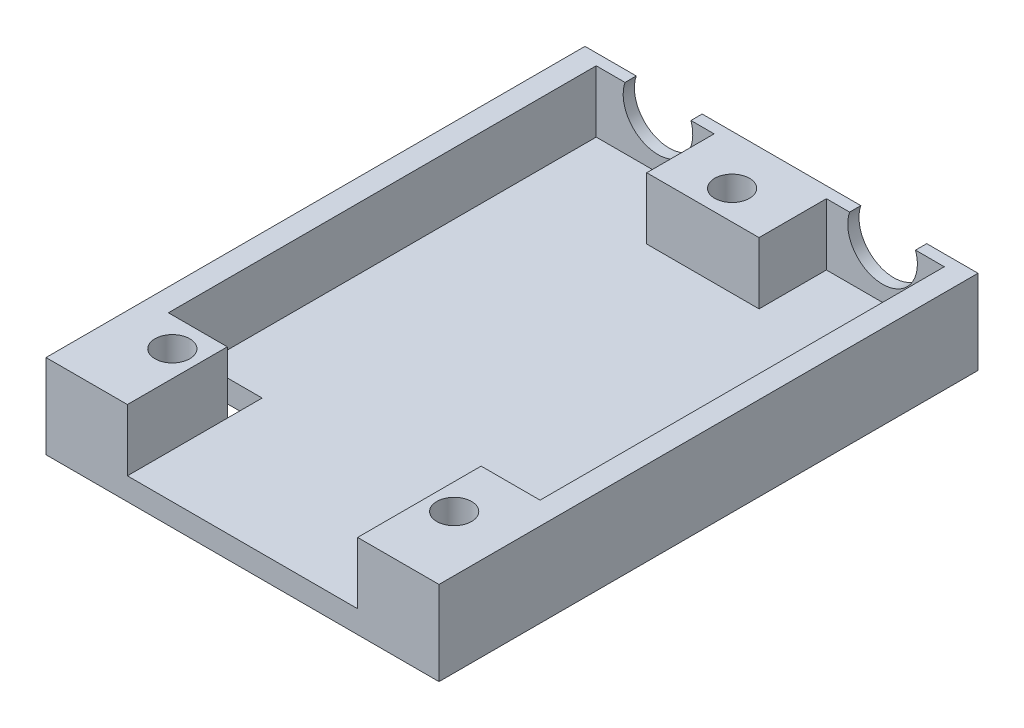
ISO-10303-21;
HEADER;
FILE_DESCRIPTION(('STEP AP214'),'2;1');
FILE_NAME('part.step','',(''),(''),'','','');
FILE_SCHEMA(('AUTOMOTIVE_DESIGN { 1 0 10303 214 1 1 1 1 }'));
ENDSEC;
DATA;
#1=APPLICATION_CONTEXT('core data for automotive mechanical design processes');
#2=APPLICATION_PROTOCOL_DEFINITION('international standard','automotive_design',2000,#1);
#3=PRODUCT_CONTEXT('',#1,'mechanical');
#4=PRODUCT('Part','Part','',(#3));
#5=PRODUCT_RELATED_PRODUCT_CATEGORY('part','',(#4));
#6=PRODUCT_DEFINITION_FORMATION('','',#4);
#7=PRODUCT_DEFINITION_CONTEXT('part definition',#1,'design');
#8=PRODUCT_DEFINITION('design','',#6,#7);
#9=PRODUCT_DEFINITION_SHAPE('','',#8);
#10=(LENGTH_UNIT() NAMED_UNIT(*) SI_UNIT(.MILLI.,.METRE.));
#11=(NAMED_UNIT(*) PLANE_ANGLE_UNIT() SI_UNIT($,.RADIAN.));
#12=(NAMED_UNIT(*) SI_UNIT($,.STERADIAN.) SOLID_ANGLE_UNIT());
#13=UNCERTAINTY_MEASURE_WITH_UNIT(LENGTH_MEASURE(1.E-05),#10,'distance_accuracy_value','');
#14=(GEOMETRIC_REPRESENTATION_CONTEXT(3) GLOBAL_UNCERTAINTY_ASSIGNED_CONTEXT((#13)) GLOBAL_UNIT_ASSIGNED_CONTEXT((#10,
#11,#12)) REPRESENTATION_CONTEXT('',''));
#15=CARTESIAN_POINT('',(0.,0.,0.));
#16=DIRECTION('',(0.,0.,1.));
#17=DIRECTION('',(1.,0.,0.));
#18=AXIS2_PLACEMENT_3D('',#15,#16,#17);
#19=CARTESIAN_POINT('',(0.,7.5,-23.));
#20=DIRECTION('',(0.,0.,-1.));
#21=DIRECTION('',(-1.,0.,0.));
#22=AXIS2_PLACEMENT_3D('',#19,#20,#21);
#23=PLANE('',#22);
#24=CARTESIAN_POINT('',(-10.,6.5,-23.));
#25=DIRECTION('',(0.,0.,-1.));
#26=DIRECTION('',(-1.,0.,0.));
#27=AXIS2_PLACEMENT_3D('',#24,#25,#26);
#28=CIRCLE('',#27,3.1);
#29=CARTESIAN_POINT('',(-12.9342801502242,7.5,-23.));
#30=VERTEX_POINT('',#29);
#31=CARTESIAN_POINT('',(-7.06571984977576,7.5,-23.));
#32=VERTEX_POINT('',#31);
#33=EDGE_CURVE('E303',#30,#32,#28,.F.);
#34=ORIENTED_EDGE('',*,*,#33,.F.);
#35=DIRECTION('',(1.,0.,0.));
#36=VECTOR('',#35,1.);
#37=CARTESIAN_POINT('',(0.,7.5,-23.));
#38=LINE('',#37,#36);
#39=CARTESIAN_POINT('',(-15.5,7.5,-23.));
#40=VERTEX_POINT('',#39);
#41=EDGE_CURVE('E494',#40,#30,#38,.T.);
#42=ORIENTED_EDGE('',*,*,#41,.F.);
#43=DIRECTION('',(0.,-1.,0.));
#44=VECTOR('',#43,1.);
#45=CARTESIAN_POINT('',(-15.5,7.5,-23.));
#46=LINE('',#45,#44);
#47=CARTESIAN_POINT('',(-15.5,2.,-23.));
#48=VERTEX_POINT('',#47);
#49=EDGE_CURVE('E249',#40,#48,#46,.T.);
#50=ORIENTED_EDGE('',*,*,#49,.T.);
#51=DIRECTION('',(1.,0.,0.));
#52=VECTOR('',#51,1.);
#53=CARTESIAN_POINT('',(0.,2.,-23.));
#54=LINE('',#53,#52);
#55=CARTESIAN_POINT('',(-4.99999999999998,2.,-23.));
#56=VERTEX_POINT('',#55);
#57=EDGE_CURVE('E502',#48,#56,#54,.T.);
#58=ORIENTED_EDGE('',*,*,#57,.T.);
#59=DIRECTION('',(0.,-1.,0.));
#60=VECTOR('',#59,1.);
#61=CARTESIAN_POINT('',(-4.99999999999998,7.5,-23.));
#62=LINE('',#61,#60);
#63=CARTESIAN_POINT('',(-4.99999999999998,7.5,-23.));
#64=VERTEX_POINT('',#63);
#65=EDGE_CURVE('E452',#64,#56,#62,.T.);
#66=ORIENTED_EDGE('',*,*,#65,.F.);
#67=EDGE_CURVE('E497',#32,#64,#38,.T.);
#68=ORIENTED_EDGE('',*,*,#67,.F.);
#69=EDGE_LOOP('',(#34,#42,#50,#58,#66,#68));
#70=FACE_BOUND('',#69,.T.);
#71=ADVANCED_FACE('F41',(#70),#23,.F.);
#72=CARTESIAN_POINT('',(10.,6.5,-23.));
#73=DIRECTION('',(0.,0.,-1.));
#74=DIRECTION('',(-1.,0.,0.));
#75=AXIS2_PLACEMENT_3D('',#72,#73,#74);
#76=CIRCLE('',#75,3.1);
#77=CARTESIAN_POINT('',(7.06571984977576,7.5,-23.));
#78=VERTEX_POINT('',#77);
#79=CARTESIAN_POINT('',(12.9342801502242,7.5,-23.));
#80=VERTEX_POINT('',#79);
#81=EDGE_CURVE('E308',#78,#80,#76,.F.);
#82=ORIENTED_EDGE('',*,*,#81,.F.);
#83=CARTESIAN_POINT('',(5.00000000000002,7.5,-23.));
#84=VERTEX_POINT('',#83);
#85=EDGE_CURVE('E498',#84,#78,#38,.T.);
#86=ORIENTED_EDGE('',*,*,#85,.F.);
#87=DIRECTION('',(0.,-1.,0.));
#88=VECTOR('',#87,1.);
#89=CARTESIAN_POINT('',(5.00000000000002,7.5,-23.));
#90=LINE('',#89,#88);
#91=CARTESIAN_POINT('',(5.00000000000002,2.,-23.));
#92=VERTEX_POINT('',#91);
#93=EDGE_CURVE('E464',#84,#92,#90,.T.);
#94=ORIENTED_EDGE('',*,*,#93,.T.);
#95=CARTESIAN_POINT('',(15.5,2.,-23.));
#96=VERTEX_POINT('',#95);
#97=EDGE_CURVE('E474',#92,#96,#54,.T.);
#98=ORIENTED_EDGE('',*,*,#97,.T.);
#99=DIRECTION('',(0.,-1.,0.));
#100=VECTOR('',#99,1.);
#101=CARTESIAN_POINT('',(15.5,7.5,-23.));
#102=LINE('',#101,#100);
#103=CARTESIAN_POINT('',(15.5,7.5,-23.));
#104=VERTEX_POINT('',#103);
#105=EDGE_CURVE('E516',#104,#96,#102,.T.);
#106=ORIENTED_EDGE('',*,*,#105,.F.);
#107=EDGE_CURVE('E493',#80,#104,#38,.T.);
#108=ORIENTED_EDGE('',*,*,#107,.F.);
#109=EDGE_LOOP('',(#82,#86,#94,#98,#106,#108));
#110=FACE_BOUND('',#109,.T.);
#111=ADVANCED_FACE('F597',(#110),#23,.F.);
#112=CARTESIAN_POINT('',(-17.5,2.,-24.));
#113=DIRECTION('',(0.,0.,1.));
#114=DIRECTION('',(1.,0.,0.));
#115=AXIS2_PLACEMENT_3D('',#112,#113,#114);
#116=PLANE('',#115);
#117=CARTESIAN_POINT('',(10.,6.5,-24.));
#118=DIRECTION('',(0.,0.,-1.));
#119=DIRECTION('',(-1.,0.,0.));
#120=AXIS2_PLACEMENT_3D('',#117,#118,#119);
#121=CIRCLE('',#120,3.1);
#122=CARTESIAN_POINT('',(7.06571984977576,7.5,-24.));
#123=VERTEX_POINT('',#122);
#124=CARTESIAN_POINT('',(12.9342801502242,7.5,-24.));
#125=VERTEX_POINT('',#124);
#126=EDGE_CURVE('E299',#123,#125,#121,.F.);
#127=ORIENTED_EDGE('',*,*,#126,.T.);
#128=DIRECTION('',(-1.,0.,0.));
#129=VECTOR('',#128,1.);
#130=CARTESIAN_POINT('',(0.,7.5,-24.));
#131=LINE('',#130,#129);
#132=CARTESIAN_POINT('',(17.5,7.5,-24.));
#133=VERTEX_POINT('',#132);
#134=EDGE_CURVE('E475',#133,#125,#131,.T.);
#135=ORIENTED_EDGE('',*,*,#134,.F.);
#136=DIRECTION('',(0.,-1.,0.));
#137=VECTOR('',#136,1.);
#138=CARTESIAN_POINT('',(17.5,2.,-24.));
#139=LINE('',#138,#137);
#140=CARTESIAN_POINT('',(17.5,0.,-24.));
#141=VERTEX_POINT('',#140);
#142=EDGE_CURVE('E537',#133,#141,#139,.T.);
#143=ORIENTED_EDGE('',*,*,#142,.T.);
#144=DIRECTION('',(-1.,0.,0.));
#145=VECTOR('',#144,1.);
#146=CARTESIAN_POINT('',(-17.5,0.,-24.));
#147=LINE('',#146,#145);
#148=CARTESIAN_POINT('',(-17.5,0.,-24.));
#149=VERTEX_POINT('',#148);
#150=EDGE_CURVE('E530',#141,#149,#147,.T.);
#151=ORIENTED_EDGE('',*,*,#150,.T.);
#152=DIRECTION('',(0.,-1.,0.));
#153=VECTOR('',#152,1.);
#154=CARTESIAN_POINT('',(-17.5,2.,-24.));
#155=LINE('',#154,#153);
#156=CARTESIAN_POINT('',(-17.5,7.5,-24.));
#157=VERTEX_POINT('',#156);
#158=EDGE_CURVE('E533',#157,#149,#155,.T.);
#159=ORIENTED_EDGE('',*,*,#158,.F.);
#160=CARTESIAN_POINT('',(-12.9342801502242,7.5,-24.));
#161=VERTEX_POINT('',#160);
#162=EDGE_CURVE('E481',#161,#157,#131,.T.);
#163=ORIENTED_EDGE('',*,*,#162,.F.);
#164=CARTESIAN_POINT('',(-10.,6.5,-24.));
#165=DIRECTION('',(0.,0.,-1.));
#166=DIRECTION('',(-1.,0.,0.));
#167=AXIS2_PLACEMENT_3D('',#164,#165,#166);
#168=CIRCLE('',#167,3.1);
#169=CARTESIAN_POINT('',(-7.06571984977576,7.5,-24.));
#170=VERTEX_POINT('',#169);
#171=EDGE_CURVE('E65',#161,#170,#168,.F.);
#172=ORIENTED_EDGE('',*,*,#171,.T.);
#173=EDGE_CURVE('E480',#123,#170,#131,.T.);
#174=ORIENTED_EDGE('',*,*,#173,.F.);
#175=EDGE_LOOP('',(#127,#135,#143,#151,#159,#163,#172,#174));
#176=FACE_BOUND('',#175,.T.);
#177=ADVANCED_FACE('F566',(#176),#116,.F.);
#178=CARTESIAN_POINT('',(0.,7.5,0.));
#179=DIRECTION('',(0.,1.,0.));
#180=DIRECTION('',(0.,0.,1.));
#181=AXIS2_PLACEMENT_3D('',#178,#179,#180);
#182=PLANE('',#181);
#183=CARTESIAN_POINT('',(12.55,7.5,17.7));
#184=DIRECTION('',(0.,1.,0.));
#185=DIRECTION('',(0.,0.,1.));
#186=AXIS2_PLACEMENT_3D('',#183,#184,#185);
#187=CIRCLE('',#186,1.55);
#188=CARTESIAN_POINT('',(12.55,7.5,19.25));
#189=VERTEX_POINT('',#188);
#190=EDGE_CURVE('E947',#189,#189,#187,.T.);
#191=ORIENTED_EDGE('',*,*,#190,.F.);
#192=EDGE_LOOP('',(#191));
#193=FACE_BOUND('',#192,.T.);
#194=ORIENTED_EDGE('',*,*,#134,.T.);
#195=DIRECTION('',(0.,0.,-1.));
#196=VECTOR('',#195,1.);
#197=CARTESIAN_POINT('',(12.9342801502242,7.5,-22.));
#198=LINE('',#197,#196);
#199=EDGE_CURVE('E11',#125,#80,#198,.F.);
#200=ORIENTED_EDGE('',*,*,#199,.T.);
#201=ORIENTED_EDGE('',*,*,#107,.T.);
#202=DIRECTION('',(0.,0.,1.));
#203=VECTOR('',#202,1.);
#204=CARTESIAN_POINT('',(15.5,7.5,0.));
#205=LINE('',#204,#203);
#206=CARTESIAN_POINT('',(15.5,7.5,13.));
#207=VERTEX_POINT('',#206);
#208=EDGE_CURVE('E255',#104,#207,#205,.T.);
#209=ORIENTED_EDGE('',*,*,#208,.T.);
#210=DIRECTION('',(-1.,0.,0.));
#211=VECTOR('',#210,1.);
#212=CARTESIAN_POINT('',(15.5,7.5,13.));
#213=LINE('',#212,#211);
#214=CARTESIAN_POINT('',(10.25,7.5,13.));
#215=VERTEX_POINT('',#214);
#216=EDGE_CURVE('E414',#207,#215,#213,.T.);
#217=ORIENTED_EDGE('',*,*,#216,.T.);
#218=DIRECTION('',(0.,0.,1.));
#219=VECTOR('',#218,1.);
#220=CARTESIAN_POINT('',(10.25,7.5,21.));
#221=LINE('',#220,#219);
#222=CARTESIAN_POINT('',(10.25,7.5,24.));
#223=VERTEX_POINT('',#222);
#224=EDGE_CURVE('E417',#215,#223,#221,.T.);
#225=ORIENTED_EDGE('',*,*,#224,.T.);
#226=DIRECTION('',(1.,0.,0.));
#227=VECTOR('',#226,1.);
#228=CARTESIAN_POINT('',(0.,7.5,24.));
#229=LINE('',#228,#227);
#230=CARTESIAN_POINT('',(17.5,7.5,24.));
#231=VERTEX_POINT('',#230);
#232=EDGE_CURVE('E485',#223,#231,#229,.T.);
#233=ORIENTED_EDGE('',*,*,#232,.T.);
#234=DIRECTION('',(0.,0.,-1.));
#235=VECTOR('',#234,1.);
#236=CARTESIAN_POINT('',(17.5,7.5,0.));
#237=LINE('',#236,#235);
#238=EDGE_CURVE('E489',#231,#133,#237,.T.);
#239=ORIENTED_EDGE('',*,*,#238,.T.);
#240=EDGE_LOOP('',(#194,#200,#201,#209,#217,#225,#233,#239));
#241=FACE_BOUND('',#240,.T.);
#242=ADVANCED_FACE('F609',(#193,#241),#182,.T.);
#243=CARTESIAN_POINT('',(0.,7.5,-19.6));
#244=DIRECTION('',(0.,1.,0.));
#245=DIRECTION('',(0.,0.,1.));
#246=AXIS2_PLACEMENT_3D('',#243,#244,#245);
#247=CIRCLE('',#246,1.55);
#248=CARTESIAN_POINT('',(0.,7.5,-18.05));
#249=VERTEX_POINT('',#248);
#250=EDGE_CURVE('E960',#249,#249,#247,.T.);
#251=ORIENTED_EDGE('',*,*,#250,.F.);
#252=EDGE_LOOP('',(#251));
#253=FACE_BOUND('',#252,.T.);
#254=ORIENTED_EDGE('',*,*,#85,.T.);
#255=DIRECTION('',(0.,0.,-1.));
#256=VECTOR('',#255,1.);
#257=CARTESIAN_POINT('',(7.06571984977576,7.5,-22.));
#258=LINE('',#257,#256);
#259=EDGE_CURVE('E50',#78,#123,#258,.T.);
#260=ORIENTED_EDGE('',*,*,#259,.T.);
#261=ORIENTED_EDGE('',*,*,#173,.T.);
#262=DIRECTION('',(0.,0.,-1.));
#263=VECTOR('',#262,1.);
#264=CARTESIAN_POINT('',(-7.06571984977576,7.5,-22.));
#265=LINE('',#264,#263);
#266=EDGE_CURVE('E552',#170,#32,#265,.F.);
#267=ORIENTED_EDGE('',*,*,#266,.T.);
#268=ORIENTED_EDGE('',*,*,#67,.T.);
#269=DIRECTION('',(0.,0.,1.));
#270=VECTOR('',#269,1.);
#271=CARTESIAN_POINT('',(-4.99999999999998,7.5,-23.));
#272=LINE('',#271,#270);
#273=CARTESIAN_POINT('',(-4.99999999999998,7.5,-17.));
#274=VERTEX_POINT('',#273);
#275=EDGE_CURVE('E441',#64,#274,#272,.T.);
#276=ORIENTED_EDGE('',*,*,#275,.T.);
#277=DIRECTION('',(1.,0.,0.));
#278=VECTOR('',#277,1.);
#279=CARTESIAN_POINT('',(-4.99999999999998,7.5,-17.));
#280=LINE('',#279,#278);
#281=CARTESIAN_POINT('',(5.00000000000002,7.5,-17.));
#282=VERTEX_POINT('',#281);
#283=EDGE_CURVE('E445',#274,#282,#280,.T.);
#284=ORIENTED_EDGE('',*,*,#283,.T.);
#285=DIRECTION('',(0.,0.,-1.));
#286=VECTOR('',#285,1.);
#287=CARTESIAN_POINT('',(5.00000000000002,7.5,-23.));
#288=LINE('',#287,#286);
#289=EDGE_CURVE('E449',#282,#84,#288,.T.);
#290=ORIENTED_EDGE('',*,*,#289,.T.);
#291=EDGE_LOOP('',(#254,#260,#261,#267,#268,#276,#284,#290));
#292=FACE_BOUND('',#291,.T.);
#293=ADVANCED_FACE('F561',(#253,#292),#182,.T.);
#294=CARTESIAN_POINT('',(-12.55,7.5,17.7));
#295=DIRECTION('',(0.,1.,0.));
#296=DIRECTION('',(0.,0.,1.));
#297=AXIS2_PLACEMENT_3D('',#294,#295,#296);
#298=CIRCLE('',#297,1.55);
#299=CARTESIAN_POINT('',(-12.55,7.5,19.25));
#300=VERTEX_POINT('',#299);
#301=EDGE_CURVE('E274',#300,#300,#298,.T.);
#302=ORIENTED_EDGE('',*,*,#301,.F.);
#303=EDGE_LOOP('',(#302));
#304=FACE_BOUND('',#303,.T.);
#305=DIRECTION('',(1.,0.,0.));
#306=VECTOR('',#305,1.);
#307=CARTESIAN_POINT('',(-15.5,7.5,15.1));
#308=LINE('',#307,#306);
#309=CARTESIAN_POINT('',(-15.5,7.5,15.1));
#310=VERTEX_POINT('',#309);
#311=CARTESIAN_POINT('',(-10.25,7.5,15.1));
#312=VERTEX_POINT('',#311);
#313=EDGE_CURVE('E258',#310,#312,#308,.T.);
#314=ORIENTED_EDGE('',*,*,#313,.F.);
#315=DIRECTION('',(0.,0.,1.));
#316=VECTOR('',#315,1.);
#317=CARTESIAN_POINT('',(-15.5,7.5,0.));
#318=LINE('',#317,#316);
#319=EDGE_CURVE('E242',#40,#310,#318,.T.);
#320=ORIENTED_EDGE('',*,*,#319,.F.);
#321=ORIENTED_EDGE('',*,*,#41,.T.);
#322=DIRECTION('',(0.,0.,-1.));
#323=VECTOR('',#322,1.);
#324=CARTESIAN_POINT('',(-12.9342801502242,7.5,-22.));
#325=LINE('',#324,#323);
#326=EDGE_CURVE('E549',#30,#161,#325,.T.);
#327=ORIENTED_EDGE('',*,*,#326,.T.);
#328=ORIENTED_EDGE('',*,*,#162,.T.);
#329=DIRECTION('',(0.,0.,1.));
#330=VECTOR('',#329,1.);
#331=CARTESIAN_POINT('',(-17.5,7.5,0.));
#332=LINE('',#331,#330);
#333=CARTESIAN_POINT('',(-17.5,7.5,24.));
#334=VERTEX_POINT('',#333);
#335=EDGE_CURVE('E479',#157,#334,#332,.T.);
#336=ORIENTED_EDGE('',*,*,#335,.T.);
#337=CARTESIAN_POINT('',(-10.25,7.5,24.));
#338=VERTEX_POINT('',#337);
#339=EDGE_CURVE('E486',#334,#338,#229,.T.);
#340=ORIENTED_EDGE('',*,*,#339,.T.);
#341=DIRECTION('',(0.,0.,-1.));
#342=VECTOR('',#341,1.);
#343=CARTESIAN_POINT('',(-10.25,7.5,21.));
#344=LINE('',#343,#342);
#345=EDGE_CURVE('E268',#338,#312,#344,.T.);
#346=ORIENTED_EDGE('',*,*,#345,.T.);
#347=EDGE_LOOP('',(#314,#320,#321,#327,#328,#336,#340,#346));
#348=FACE_BOUND('',#347,.T.);
#349=ADVANCED_FACE('F266',(#304,#348),#182,.T.);
#350=CARTESIAN_POINT('',(0.,0.,0.));
#351=DIRECTION('',(0.,1.,0.));
#352=DIRECTION('',(0.,0.,1.));
#353=AXIS2_PLACEMENT_3D('',#350,#351,#352);
#354=PLANE('',#353);
#355=DIRECTION('',(1.,0.,0.));
#356=VECTOR('',#355,1.);
#357=CARTESIAN_POINT('',(-15.5,0.,12.));
#358=LINE('',#357,#356);
#359=CARTESIAN_POINT('',(-15.5,0.,12.));
#360=VERTEX_POINT('',#359);
#361=CARTESIAN_POINT('',(-10.25,0.,12.));
#362=VERTEX_POINT('',#361);
#363=EDGE_CURVE('E589',#360,#362,#358,.T.);
#364=ORIENTED_EDGE('',*,*,#363,.F.);
#365=DIRECTION('',(0.,0.,-1.));
#366=VECTOR('',#365,1.);
#367=CARTESIAN_POINT('',(-15.5,0.,12.));
#368=LINE('',#367,#366);
#369=CARTESIAN_POINT('',(-15.5,0.,15.1));
#370=VERTEX_POINT('',#369);
#371=EDGE_CURVE('E278',#370,#360,#368,.T.);
#372=ORIENTED_EDGE('',*,*,#371,.F.);
#373=DIRECTION('',(-1.,0.,0.));
#374=VECTOR('',#373,1.);
#375=CARTESIAN_POINT('',(-15.5,0.,15.1));
#376=LINE('',#375,#374);
#377=CARTESIAN_POINT('',(-10.25,0.,15.1));
#378=VERTEX_POINT('',#377);
#379=EDGE_CURVE('E261',#378,#370,#376,.T.);
#380=ORIENTED_EDGE('',*,*,#379,.F.);
#381=DIRECTION('',(0.,0.,1.));
#382=VECTOR('',#381,1.);
#383=CARTESIAN_POINT('',(-10.25,0.,12.));
#384=LINE('',#383,#382);
#385=EDGE_CURVE('E284',#362,#378,#384,.T.);
#386=ORIENTED_EDGE('',*,*,#385,.F.);
#387=EDGE_LOOP('',(#364,#372,#380,#386));
#388=FACE_BOUND('',#387,.T.);
#389=DIRECTION('',(0.,0.,-1.));
#390=VECTOR('',#389,1.);
#391=CARTESIAN_POINT('',(-2.44999999999999,0.,8.5));
#392=LINE('',#391,#390);
#393=CARTESIAN_POINT('',(-2.44999999999999,0.,8.5));
#394=VERTEX_POINT('',#393);
#395=CARTESIAN_POINT('',(-2.44999999999999,0.,3.6));
#396=VERTEX_POINT('',#395);
#397=EDGE_CURVE('E356',#394,#396,#392,.T.);
#398=ORIENTED_EDGE('',*,*,#397,.F.);
#399=DIRECTION('',(-1.,0.,0.));
#400=VECTOR('',#399,1.);
#401=CARTESIAN_POINT('',(-2.44999999999999,0.,8.5));
#402=LINE('',#401,#400);
#403=CARTESIAN_POINT('',(2.45000000000001,0.,8.5));
#404=VERTEX_POINT('',#403);
#405=EDGE_CURVE('E362',#404,#394,#402,.T.);
#406=ORIENTED_EDGE('',*,*,#405,.F.);
#407=DIRECTION('',(0.,0.,1.));
#408=VECTOR('',#407,1.);
#409=CARTESIAN_POINT('',(2.45000000000001,0.,8.5));
#410=LINE('',#409,#408);
#411=CARTESIAN_POINT('',(2.45000000000001,0.,3.6));
#412=VERTEX_POINT('',#411);
#413=EDGE_CURVE('E379',#412,#404,#410,.T.);
#414=ORIENTED_EDGE('',*,*,#413,.F.);
#415=DIRECTION('',(1.,0.,0.));
#416=VECTOR('',#415,1.);
#417=CARTESIAN_POINT('',(-2.44999999999999,0.,3.6));
#418=LINE('',#417,#416);
#419=EDGE_CURVE('E375',#396,#412,#418,.T.);
#420=ORIENTED_EDGE('',*,*,#419,.F.);
#421=EDGE_LOOP('',(#398,#406,#414,#420));
#422=FACE_BOUND('',#421,.T.);
#423=DIRECTION('',(0.,0.,1.));
#424=VECTOR('',#423,1.);
#425=CARTESIAN_POINT('',(-17.5,0.,-24.));
#426=LINE('',#425,#424);
#427=CARTESIAN_POINT('',(-17.5,0.,24.));
#428=VERTEX_POINT('',#427);
#429=EDGE_CURVE('E520',#149,#428,#426,.T.);
#430=ORIENTED_EDGE('',*,*,#429,.F.);
#431=ORIENTED_EDGE('',*,*,#150,.F.);
#432=DIRECTION('',(0.,0.,-1.));
#433=VECTOR('',#432,1.);
#434=CARTESIAN_POINT('',(17.5,0.,-24.));
#435=LINE('',#434,#433);
#436=CARTESIAN_POINT('',(17.5,0.,24.));
#437=VERTEX_POINT('',#436);
#438=EDGE_CURVE('E527',#437,#141,#435,.T.);
#439=ORIENTED_EDGE('',*,*,#438,.F.);
#440=DIRECTION('',(1.,0.,0.));
#441=VECTOR('',#440,1.);
#442=CARTESIAN_POINT('',(-17.5,0.,24.));
#443=LINE('',#442,#441);
#444=EDGE_CURVE('E524',#428,#437,#443,.T.);
#445=ORIENTED_EDGE('',*,*,#444,.F.);
#446=EDGE_LOOP('',(#430,#431,#439,#445));
#447=FACE_BOUND('',#446,.T.);
#448=DIRECTION('',(0.,0.,-1.));
#449=VECTOR('',#448,1.);
#450=CARTESIAN_POINT('',(-2.44999999999999,0.,-3.6));
#451=LINE('',#450,#449);
#452=CARTESIAN_POINT('',(-2.44999999999999,0.,-3.6));
#453=VERTEX_POINT('',#452);
#454=CARTESIAN_POINT('',(-2.44999999999999,0.,-8.5));
#455=VERTEX_POINT('',#454);
#456=EDGE_CURVE('E311',#453,#455,#451,.T.);
#457=ORIENTED_EDGE('',*,*,#456,.F.);
#458=DIRECTION('',(-1.,0.,0.));
#459=VECTOR('',#458,1.);
#460=CARTESIAN_POINT('',(-2.44999999999999,0.,-3.6));
#461=LINE('',#460,#459);
#462=CARTESIAN_POINT('',(2.45000000000001,0.,-3.6));
#463=VERTEX_POINT('',#462);
#464=EDGE_CURVE('E317',#463,#453,#461,.T.);
#465=ORIENTED_EDGE('',*,*,#464,.F.);
#466=DIRECTION('',(0.,0.,1.));
#467=VECTOR('',#466,1.);
#468=CARTESIAN_POINT('',(2.45000000000001,0.,-3.6));
#469=LINE('',#468,#467);
#470=CARTESIAN_POINT('',(2.45000000000001,0.,-8.5));
#471=VERTEX_POINT('',#470);
#472=EDGE_CURVE('E334',#471,#463,#469,.T.);
#473=ORIENTED_EDGE('',*,*,#472,.F.);
#474=DIRECTION('',(1.,0.,0.));
#475=VECTOR('',#474,1.);
#476=CARTESIAN_POINT('',(-2.44999999999999,0.,-8.5));
#477=LINE('',#476,#475);
#478=EDGE_CURVE('E330',#455,#471,#477,.T.);
#479=ORIENTED_EDGE('',*,*,#478,.F.);
#480=EDGE_LOOP('',(#457,#465,#473,#479));
#481=FACE_BOUND('',#480,.T.);
#482=ADVANCED_FACE('F622',(#388,#422,#447,#481),#354,.F.);
#483=CARTESIAN_POINT('',(0.,2.,0.));
#484=DIRECTION('',(0.,1.,0.));
#485=DIRECTION('',(0.,0.,1.));
#486=AXIS2_PLACEMENT_3D('',#483,#484,#485);
#487=PLANE('',#486);
#488=DIRECTION('',(-1.,0.,0.));
#489=VECTOR('',#488,1.);
#490=CARTESIAN_POINT('',(0.,2.,12.));
#491=LINE('',#490,#489);
#492=CARTESIAN_POINT('',(-10.25,2.,12.));
#493=VERTEX_POINT('',#492);
#494=CARTESIAN_POINT('',(-15.5,2.,12.));
#495=VERTEX_POINT('',#494);
#496=EDGE_CURVE('E296',#493,#495,#491,.T.);
#497=ORIENTED_EDGE('',*,*,#496,.F.);
#498=DIRECTION('',(0.,0.,-1.));
#499=VECTOR('',#498,1.);
#500=CARTESIAN_POINT('',(-10.25,2.,0.));
#501=LINE('',#500,#499);
#502=CARTESIAN_POINT('',(-10.25,2.,15.1));
#503=VERTEX_POINT('',#502);
#504=EDGE_CURVE('E293',#503,#493,#501,.T.);
#505=ORIENTED_EDGE('',*,*,#504,.F.);
#506=DIRECTION('',(0.,0.,-1.));
#507=VECTOR('',#506,1.);
#508=CARTESIAN_POINT('',(-10.25,2.,21.));
#509=LINE('',#508,#507);
#510=CARTESIAN_POINT('',(-10.25,2.,24.));
#511=VERTEX_POINT('',#510);
#512=EDGE_CURVE('E434',#511,#503,#509,.T.);
#513=ORIENTED_EDGE('',*,*,#512,.F.);
#514=DIRECTION('',(1.,0.,0.));
#515=VECTOR('',#514,1.);
#516=CARTESIAN_POINT('',(-10.25,2.,24.));
#517=LINE('',#516,#515);
#518=CARTESIAN_POINT('',(10.25,2.,24.));
#519=VERTEX_POINT('',#518);
#520=EDGE_CURVE('E407',#511,#519,#517,.T.);
#521=ORIENTED_EDGE('',*,*,#520,.T.);
#522=DIRECTION('',(0.,0.,1.));
#523=VECTOR('',#522,1.);
#524=CARTESIAN_POINT('',(10.25,2.,21.));
#525=LINE('',#524,#523);
#526=CARTESIAN_POINT('',(10.25,2.,13.));
#527=VERTEX_POINT('',#526);
#528=EDGE_CURVE('E418',#527,#519,#525,.T.);
#529=ORIENTED_EDGE('',*,*,#528,.F.);
#530=DIRECTION('',(-1.,0.,0.));
#531=VECTOR('',#530,1.);
#532=CARTESIAN_POINT('',(15.5,2.,13.));
#533=LINE('',#532,#531);
#534=CARTESIAN_POINT('',(15.5,2.,13.));
#535=VERTEX_POINT('',#534);
#536=EDGE_CURVE('E406',#535,#527,#533,.T.);
#537=ORIENTED_EDGE('',*,*,#536,.F.);
#538=DIRECTION('',(0.,0.,1.));
#539=VECTOR('',#538,1.);
#540=CARTESIAN_POINT('',(15.5,2.,0.));
#541=LINE('',#540,#539);
#542=EDGE_CURVE('E506',#96,#535,#541,.T.);
#543=ORIENTED_EDGE('',*,*,#542,.F.);
#544=ORIENTED_EDGE('',*,*,#97,.F.);
#545=DIRECTION('',(0.,0.,-1.));
#546=VECTOR('',#545,1.);
#547=CARTESIAN_POINT('',(5.00000000000002,2.,-23.));
#548=LINE('',#547,#546);
#549=CARTESIAN_POINT('',(5.00000000000002,2.,-17.));
#550=VERTEX_POINT('',#549);
#551=EDGE_CURVE('E446',#550,#92,#548,.T.);
#552=ORIENTED_EDGE('',*,*,#551,.F.);
#553=DIRECTION('',(1.,0.,0.));
#554=VECTOR('',#553,1.);
#555=CARTESIAN_POINT('',(-4.99999999999998,2.,-17.));
#556=LINE('',#555,#554);
#557=CARTESIAN_POINT('',(-4.99999999999998,2.,-17.));
#558=VERTEX_POINT('',#557);
#559=EDGE_CURVE('E456',#558,#550,#556,.T.);
#560=ORIENTED_EDGE('',*,*,#559,.F.);
#561=DIRECTION('',(0.,0.,1.));
#562=VECTOR('',#561,1.);
#563=CARTESIAN_POINT('',(-4.99999999999998,2.,-23.));
#564=LINE('',#563,#562);
#565=EDGE_CURVE('E437',#56,#558,#564,.T.);
#566=ORIENTED_EDGE('',*,*,#565,.F.);
#567=ORIENTED_EDGE('',*,*,#57,.F.);
#568=DIRECTION('',(0.,0.,1.));
#569=VECTOR('',#568,1.);
#570=CARTESIAN_POINT('',(-15.5,2.,0.));
#571=LINE('',#570,#569);
#572=EDGE_CURVE('E510',#48,#495,#571,.T.);
#573=ORIENTED_EDGE('',*,*,#572,.T.);
#574=EDGE_LOOP('',(#497,#505,#513,#521,#529,#537,#543,#544,#552,#560,#566,#567,#573));
#575=FACE_BOUND('',#574,.T.);
#576=ADVANCED_FACE('F603',(#575),#487,.T.);
#577=CARTESIAN_POINT('',(15.5,7.5,0.));
#578=DIRECTION('',(1.,0.,0.));
#579=DIRECTION('',(0.,0.,-1.));
#580=AXIS2_PLACEMENT_3D('',#577,#578,#579);
#581=PLANE('',#580);
#582=DIRECTION('',(0.,-1.,0.));
#583=VECTOR('',#582,1.);
#584=CARTESIAN_POINT('',(15.5,7.5,13.));
#585=LINE('',#584,#583);
#586=EDGE_CURVE('E430',#207,#535,#585,.T.);
#587=ORIENTED_EDGE('',*,*,#586,.F.);
#588=ORIENTED_EDGE('',*,*,#208,.F.);
#589=ORIENTED_EDGE('',*,*,#105,.T.);
#590=ORIENTED_EDGE('',*,*,#542,.T.);
#591=EDGE_LOOP('',(#587,#588,#589,#590));
#592=FACE_BOUND('',#591,.T.);
#593=ADVANCED_FACE('F606',(#592),#581,.F.);
#594=CARTESIAN_POINT('',(-15.5,7.5,0.));
#595=DIRECTION('',(1.,0.,0.));
#596=DIRECTION('',(0.,0.,-1.));
#597=AXIS2_PLACEMENT_3D('',#594,#595,#596);
#598=PLANE('',#597);
#599=ORIENTED_EDGE('',*,*,#319,.T.);
#600=DIRECTION('',(0.,1.,0.));
#601=VECTOR('',#600,1.);
#602=CARTESIAN_POINT('',(-15.5,-6.09692545468616,15.1));
#603=LINE('',#602,#601);
#604=EDGE_CURVE('E245',#370,#310,#603,.T.);
#605=ORIENTED_EDGE('',*,*,#604,.F.);
#606=ORIENTED_EDGE('',*,*,#371,.T.);
#607=DIRECTION('',(0.,1.,0.));
#608=VECTOR('',#607,1.);
#609=CARTESIAN_POINT('',(-15.5,-6.09692545468616,12.));
#610=LINE('',#609,#608);
#611=EDGE_CURVE('E280',#360,#495,#610,.T.);
#612=ORIENTED_EDGE('',*,*,#611,.T.);
#613=ORIENTED_EDGE('',*,*,#572,.F.);
#614=ORIENTED_EDGE('',*,*,#49,.F.);
#615=EDGE_LOOP('',(#599,#605,#606,#612,#613,#614));
#616=FACE_BOUND('',#615,.T.);
#617=ADVANCED_FACE('F244',(#616),#598,.T.);
#618=CARTESIAN_POINT('',(-17.5,2.,-24.));
#619=DIRECTION('',(1.,0.,0.));
#620=DIRECTION('',(0.,0.,-1.));
#621=AXIS2_PLACEMENT_3D('',#618,#619,#620);
#622=PLANE('',#621);
#623=ORIENTED_EDGE('',*,*,#429,.T.);
#624=DIRECTION('',(0.,-1.,0.));
#625=VECTOR('',#624,1.);
#626=CARTESIAN_POINT('',(-17.5,2.,24.));
#627=LINE('',#626,#625);
#628=EDGE_CURVE('E545',#334,#428,#627,.T.);
#629=ORIENTED_EDGE('',*,*,#628,.F.);
#630=ORIENTED_EDGE('',*,*,#335,.F.);
#631=ORIENTED_EDGE('',*,*,#158,.T.);
#632=EDGE_LOOP('',(#623,#629,#630,#631));
#633=FACE_BOUND('',#632,.T.);
#634=ADVANCED_FACE('F43',(#633),#622,.F.);
#635=CARTESIAN_POINT('',(-17.5,2.,24.));
#636=DIRECTION('',(0.,0.,-1.));
#637=DIRECTION('',(-1.,0.,0.));
#638=AXIS2_PLACEMENT_3D('',#635,#636,#637);
#639=PLANE('',#638);
#640=ORIENTED_EDGE('',*,*,#232,.F.);
#641=DIRECTION('',(0.,1.,0.));
#642=VECTOR('',#641,1.);
#643=CARTESIAN_POINT('',(10.25,7.5,24.));
#644=LINE('',#643,#642);
#645=EDGE_CURVE('E402',#519,#223,#644,.T.);
#646=ORIENTED_EDGE('',*,*,#645,.F.);
#647=ORIENTED_EDGE('',*,*,#520,.F.);
#648=DIRECTION('',(0.,-1.,0.));
#649=VECTOR('',#648,1.);
#650=CARTESIAN_POINT('',(-10.25,7.5,24.));
#651=LINE('',#650,#649);
#652=EDGE_CURVE('E401',#338,#511,#651,.T.);
#653=ORIENTED_EDGE('',*,*,#652,.F.);
#654=ORIENTED_EDGE('',*,*,#339,.F.);
#655=ORIENTED_EDGE('',*,*,#628,.T.);
#656=ORIENTED_EDGE('',*,*,#444,.T.);
#657=DIRECTION('',(0.,-1.,0.));
#658=VECTOR('',#657,1.);
#659=CARTESIAN_POINT('',(17.5,2.,24.));
#660=LINE('',#659,#658);
#661=EDGE_CURVE('E541',#231,#437,#660,.T.);
#662=ORIENTED_EDGE('',*,*,#661,.F.);
#663=EDGE_LOOP('',(#640,#646,#647,#653,#654,#655,#656,#662));
#664=FACE_BOUND('',#663,.T.);
#665=ADVANCED_FACE('F579',(#664),#639,.F.);
#666=CARTESIAN_POINT('',(17.5,2.,-24.));
#667=DIRECTION('',(-1.,0.,0.));
#668=DIRECTION('',(0.,0.,1.));
#669=AXIS2_PLACEMENT_3D('',#666,#667,#668);
#670=PLANE('',#669);
#671=ORIENTED_EDGE('',*,*,#438,.T.);
#672=ORIENTED_EDGE('',*,*,#142,.F.);
#673=ORIENTED_EDGE('',*,*,#238,.F.);
#674=ORIENTED_EDGE('',*,*,#661,.T.);
#675=EDGE_LOOP('',(#671,#672,#673,#674));
#676=FACE_BOUND('',#675,.T.);
#677=ADVANCED_FACE('F620',(#676),#670,.F.);
#678=CARTESIAN_POINT('',(-4.99999999999998,7.5,-23.));
#679=DIRECTION('',(1.,0.,0.));
#680=DIRECTION('',(0.,0.,-1.));
#681=AXIS2_PLACEMENT_3D('',#678,#679,#680);
#682=PLANE('',#681);
#683=ORIENTED_EDGE('',*,*,#565,.T.);
#684=DIRECTION('',(0.,-1.,0.));
#685=VECTOR('',#684,1.);
#686=CARTESIAN_POINT('',(-4.99999999999998,7.5,-17.));
#687=LINE('',#686,#685);
#688=EDGE_CURVE('E471',#274,#558,#687,.T.);
#689=ORIENTED_EDGE('',*,*,#688,.F.);
#690=ORIENTED_EDGE('',*,*,#275,.F.);
#691=ORIENTED_EDGE('',*,*,#65,.T.);
#692=EDGE_LOOP('',(#683,#689,#690,#691));
#693=FACE_BOUND('',#692,.T.);
#694=ADVANCED_FACE('F668',(#693),#682,.F.);
#695=CARTESIAN_POINT('',(-4.99999999999998,7.5,-17.));
#696=DIRECTION('',(0.,0.,-1.));
#697=DIRECTION('',(-1.,0.,0.));
#698=AXIS2_PLACEMENT_3D('',#695,#696,#697);
#699=PLANE('',#698);
#700=ORIENTED_EDGE('',*,*,#559,.T.);
#701=DIRECTION('',(0.,-1.,0.));
#702=VECTOR('',#701,1.);
#703=CARTESIAN_POINT('',(5.00000000000002,7.5,-17.));
#704=LINE('',#703,#702);
#705=EDGE_CURVE('E468',#282,#550,#704,.T.);
#706=ORIENTED_EDGE('',*,*,#705,.F.);
#707=ORIENTED_EDGE('',*,*,#283,.F.);
#708=ORIENTED_EDGE('',*,*,#688,.T.);
#709=EDGE_LOOP('',(#700,#706,#707,#708));
#710=FACE_BOUND('',#709,.T.);
#711=ADVANCED_FACE('F685',(#710),#699,.F.);
#712=CARTESIAN_POINT('',(5.00000000000002,7.5,-23.));
#713=DIRECTION('',(-1.,0.,0.));
#714=DIRECTION('',(0.,0.,1.));
#715=AXIS2_PLACEMENT_3D('',#712,#713,#714);
#716=PLANE('',#715);
#717=ORIENTED_EDGE('',*,*,#551,.T.);
#718=ORIENTED_EDGE('',*,*,#93,.F.);
#719=ORIENTED_EDGE('',*,*,#289,.F.);
#720=ORIENTED_EDGE('',*,*,#705,.T.);
#721=EDGE_LOOP('',(#717,#718,#719,#720));
#722=FACE_BOUND('',#721,.T.);
#723=ADVANCED_FACE('F689',(#722),#716,.F.);
#724=CARTESIAN_POINT('',(-10.25,7.5,21.));
#725=DIRECTION('',(-1.,0.,0.));
#726=DIRECTION('',(0.,0.,1.));
#727=AXIS2_PLACEMENT_3D('',#724,#725,#726);
#728=PLANE('',#727);
#729=ORIENTED_EDGE('',*,*,#512,.T.);
#730=DIRECTION('',(0.,1.,0.));
#731=VECTOR('',#730,1.);
#732=CARTESIAN_POINT('',(-10.25,-6.09692545468616,15.1));
#733=LINE('',#732,#731);
#734=EDGE_CURVE('E263',#503,#312,#733,.T.);
#735=ORIENTED_EDGE('',*,*,#734,.T.);
#736=ORIENTED_EDGE('',*,*,#345,.F.);
#737=ORIENTED_EDGE('',*,*,#652,.T.);
#738=EDGE_LOOP('',(#729,#735,#736,#737));
#739=FACE_BOUND('',#738,.T.);
#740=ADVANCED_FACE('F585',(#739),#728,.F.);
#741=CARTESIAN_POINT('',(15.5,7.5,13.));
#742=DIRECTION('',(0.,0.,1.));
#743=DIRECTION('',(1.,0.,0.));
#744=AXIS2_PLACEMENT_3D('',#741,#742,#743);
#745=PLANE('',#744);
#746=ORIENTED_EDGE('',*,*,#536,.T.);
#747=DIRECTION('',(0.,-1.,0.));
#748=VECTOR('',#747,1.);
#749=CARTESIAN_POINT('',(10.25,7.5,13.));
#750=LINE('',#749,#748);
#751=EDGE_CURVE('E421',#215,#527,#750,.T.);
#752=ORIENTED_EDGE('',*,*,#751,.F.);
#753=ORIENTED_EDGE('',*,*,#216,.F.);
#754=ORIENTED_EDGE('',*,*,#586,.T.);
#755=EDGE_LOOP('',(#746,#752,#753,#754));
#756=FACE_BOUND('',#755,.T.);
#757=ADVANCED_FACE('F612',(#756),#745,.F.);
#758=CARTESIAN_POINT('',(10.25,7.5,21.));
#759=DIRECTION('',(1.,0.,0.));
#760=DIRECTION('',(0.,0.,-1.));
#761=AXIS2_PLACEMENT_3D('',#758,#759,#760);
#762=PLANE('',#761);
#763=ORIENTED_EDGE('',*,*,#528,.T.);
#764=ORIENTED_EDGE('',*,*,#645,.T.);
#765=ORIENTED_EDGE('',*,*,#224,.F.);
#766=ORIENTED_EDGE('',*,*,#751,.T.);
#767=EDGE_LOOP('',(#763,#764,#765,#766));
#768=FACE_BOUND('',#767,.T.);
#769=ADVANCED_FACE('F615',(#768),#762,.F.);
#770=CARTESIAN_POINT('',(-2.44999999999999,-2.,8.5));
#771=DIRECTION('',(1.,0.,0.));
#772=DIRECTION('',(0.,0.,-1.));
#773=AXIS2_PLACEMENT_3D('',#770,#771,#772);
#774=PLANE('',#773);
#775=ORIENTED_EDGE('',*,*,#397,.T.);
#776=DIRECTION('',(0.,1.,0.));
#777=VECTOR('',#776,1.);
#778=CARTESIAN_POINT('',(-2.44999999999999,-2.,3.6));
#779=LINE('',#778,#777);
#780=CARTESIAN_POINT('',(-2.44999999999999,-2.,3.6));
#781=VERTEX_POINT('',#780);
#782=EDGE_CURVE('E397',#781,#396,#779,.T.);
#783=ORIENTED_EDGE('',*,*,#782,.F.);
#784=DIRECTION('',(0.,0.,-1.));
#785=VECTOR('',#784,1.);
#786=CARTESIAN_POINT('',(-2.44999999999999,-2.,8.5));
#787=LINE('',#786,#785);
#788=CARTESIAN_POINT('',(-2.44999999999999,-2.,8.5));
#789=VERTEX_POINT('',#788);
#790=EDGE_CURVE('E357',#789,#781,#787,.T.);
#791=ORIENTED_EDGE('',*,*,#790,.F.);
#792=DIRECTION('',(0.,1.,0.));
#793=VECTOR('',#792,1.);
#794=CARTESIAN_POINT('',(-2.44999999999999,-2.,8.5));
#795=LINE('',#794,#793);
#796=EDGE_CURVE('E371',#789,#394,#795,.T.);
#797=ORIENTED_EDGE('',*,*,#796,.T.);
#798=EDGE_LOOP('',(#775,#783,#791,#797));
#799=FACE_BOUND('',#798,.T.);
#800=ADVANCED_FACE('F700',(#799),#774,.F.);
#801=CARTESIAN_POINT('',(-2.44999999999999,-2.,3.6));
#802=DIRECTION('',(0.,0.,1.));
#803=DIRECTION('',(1.,0.,0.));
#804=AXIS2_PLACEMENT_3D('',#801,#802,#803);
#805=PLANE('',#804);
#806=ORIENTED_EDGE('',*,*,#419,.T.);
#807=DIRECTION('',(0.,1.,0.));
#808=VECTOR('',#807,1.);
#809=CARTESIAN_POINT('',(2.45000000000001,-2.,3.6));
#810=LINE('',#809,#808);
#811=CARTESIAN_POINT('',(2.45000000000001,-2.,3.6));
#812=VERTEX_POINT('',#811);
#813=EDGE_CURVE('E393',#812,#412,#810,.T.);
#814=ORIENTED_EDGE('',*,*,#813,.F.);
#815=DIRECTION('',(1.,0.,0.));
#816=VECTOR('',#815,1.);
#817=CARTESIAN_POINT('',(-2.44999999999999,-2.,3.6));
#818=LINE('',#817,#816);
#819=EDGE_CURVE('E361',#781,#812,#818,.T.);
#820=ORIENTED_EDGE('',*,*,#819,.F.);
#821=ORIENTED_EDGE('',*,*,#782,.T.);
#822=EDGE_LOOP('',(#806,#814,#820,#821));
#823=FACE_BOUND('',#822,.T.);
#824=ADVANCED_FACE('F703',(#823),#805,.F.);
#825=CARTESIAN_POINT('',(2.45000000000001,-2.,8.5));
#826=DIRECTION('',(-1.,0.,0.));
#827=DIRECTION('',(0.,0.,1.));
#828=AXIS2_PLACEMENT_3D('',#825,#826,#827);
#829=PLANE('',#828);
#830=ORIENTED_EDGE('',*,*,#413,.T.);
#831=DIRECTION('',(0.,1.,0.));
#832=VECTOR('',#831,1.);
#833=CARTESIAN_POINT('',(2.45000000000001,-2.,8.5));
#834=LINE('',#833,#832);
#835=CARTESIAN_POINT('',(2.45000000000001,-2.,8.5));
#836=VERTEX_POINT('',#835);
#837=EDGE_CURVE('E389',#836,#404,#834,.T.);
#838=ORIENTED_EDGE('',*,*,#837,.F.);
#839=DIRECTION('',(0.,0.,1.));
#840=VECTOR('',#839,1.);
#841=CARTESIAN_POINT('',(2.45000000000001,-2.,8.5));
#842=LINE('',#841,#840);
#843=EDGE_CURVE('E365',#812,#836,#842,.T.);
#844=ORIENTED_EDGE('',*,*,#843,.F.);
#845=ORIENTED_EDGE('',*,*,#813,.T.);
#846=EDGE_LOOP('',(#830,#838,#844,#845));
#847=FACE_BOUND('',#846,.T.);
#848=ADVANCED_FACE('F707',(#847),#829,.F.);
#849=CARTESIAN_POINT('',(-2.44999999999999,-2.,8.5));
#850=DIRECTION('',(0.,0.,-1.));
#851=DIRECTION('',(-1.,0.,0.));
#852=AXIS2_PLACEMENT_3D('',#849,#850,#851);
#853=PLANE('',#852);
#854=ORIENTED_EDGE('',*,*,#405,.T.);
#855=ORIENTED_EDGE('',*,*,#796,.F.);
#856=DIRECTION('',(-1.,0.,0.));
#857=VECTOR('',#856,1.);
#858=CARTESIAN_POINT('',(-2.44999999999999,-2.,8.5));
#859=LINE('',#858,#857);
#860=EDGE_CURVE('E368',#836,#789,#859,.T.);
#861=ORIENTED_EDGE('',*,*,#860,.F.);
#862=ORIENTED_EDGE('',*,*,#837,.T.);
#863=EDGE_LOOP('',(#854,#855,#861,#862));
#864=FACE_BOUND('',#863,.T.);
#865=ADVANCED_FACE('F711',(#864),#853,.F.);
#866=CARTESIAN_POINT('',(0.,-2.,0.));
#867=DIRECTION('',(0.,-1.,0.));
#868=DIRECTION('',(0.,0.,-1.));
#869=AXIS2_PLACEMENT_3D('',#866,#867,#868);
#870=PLANE('',#869);
#871=ORIENTED_EDGE('',*,*,#790,.T.);
#872=ORIENTED_EDGE('',*,*,#819,.T.);
#873=ORIENTED_EDGE('',*,*,#843,.T.);
#874=ORIENTED_EDGE('',*,*,#860,.T.);
#875=EDGE_LOOP('',(#871,#872,#873,#874));
#876=FACE_BOUND('',#875,.T.);
#877=ADVANCED_FACE('F651',(#876),#870,.T.);
#878=CARTESIAN_POINT('',(-2.44999999999999,-2.,-3.6));
#879=DIRECTION('',(1.,0.,0.));
#880=DIRECTION('',(0.,0.,-1.));
#881=AXIS2_PLACEMENT_3D('',#878,#879,#880);
#882=PLANE('',#881);
#883=ORIENTED_EDGE('',*,*,#456,.T.);
#884=DIRECTION('',(0.,1.,0.));
#885=VECTOR('',#884,1.);
#886=CARTESIAN_POINT('',(-2.44999999999999,-2.,-8.5));
#887=LINE('',#886,#885);
#888=CARTESIAN_POINT('',(-2.44999999999999,-2.,-8.5));
#889=VERTEX_POINT('',#888);
#890=EDGE_CURVE('E352',#889,#455,#887,.T.);
#891=ORIENTED_EDGE('',*,*,#890,.F.);
#892=DIRECTION('',(0.,0.,-1.));
#893=VECTOR('',#892,1.);
#894=CARTESIAN_POINT('',(-2.44999999999999,-2.,-3.6));
#895=LINE('',#894,#893);
#896=CARTESIAN_POINT('',(-2.44999999999999,-2.,-3.6));
#897=VERTEX_POINT('',#896);
#898=EDGE_CURVE('E312',#897,#889,#895,.T.);
#899=ORIENTED_EDGE('',*,*,#898,.F.);
#900=DIRECTION('',(0.,1.,0.));
#901=VECTOR('',#900,1.);
#902=CARTESIAN_POINT('',(-2.44999999999999,-2.,-3.6));
#903=LINE('',#902,#901);
#904=EDGE_CURVE('E326',#897,#453,#903,.T.);
#905=ORIENTED_EDGE('',*,*,#904,.T.);
#906=EDGE_LOOP('',(#883,#891,#899,#905));
#907=FACE_BOUND('',#906,.T.);
#908=ADVANCED_FACE('F635',(#907),#882,.F.);
#909=CARTESIAN_POINT('',(-2.44999999999999,-2.,-8.5));
#910=DIRECTION('',(0.,0.,1.));
#911=DIRECTION('',(1.,0.,0.));
#912=AXIS2_PLACEMENT_3D('',#909,#910,#911);
#913=PLANE('',#912);
#914=ORIENTED_EDGE('',*,*,#478,.T.);
#915=DIRECTION('',(0.,1.,0.));
#916=VECTOR('',#915,1.);
#917=CARTESIAN_POINT('',(2.45000000000001,-2.,-8.5));
#918=LINE('',#917,#916);
#919=CARTESIAN_POINT('',(2.45000000000001,-2.,-8.5));
#920=VERTEX_POINT('',#919);
#921=EDGE_CURVE('E348',#920,#471,#918,.T.);
#922=ORIENTED_EDGE('',*,*,#921,.F.);
#923=DIRECTION('',(1.,0.,0.));
#924=VECTOR('',#923,1.);
#925=CARTESIAN_POINT('',(-2.44999999999999,-2.,-8.5));
#926=LINE('',#925,#924);
#927=EDGE_CURVE('E316',#889,#920,#926,.T.);
#928=ORIENTED_EDGE('',*,*,#927,.F.);
#929=ORIENTED_EDGE('',*,*,#890,.T.);
#930=EDGE_LOOP('',(#914,#922,#928,#929));
#931=FACE_BOUND('',#930,.T.);
#932=ADVANCED_FACE('F643',(#931),#913,.F.);
#933=CARTESIAN_POINT('',(2.45000000000001,-2.,-3.6));
#934=DIRECTION('',(-1.,0.,0.));
#935=DIRECTION('',(0.,0.,1.));
#936=AXIS2_PLACEMENT_3D('',#933,#934,#935);
#937=PLANE('',#936);
#938=ORIENTED_EDGE('',*,*,#472,.T.);
#939=DIRECTION('',(0.,1.,0.));
#940=VECTOR('',#939,1.);
#941=CARTESIAN_POINT('',(2.45000000000001,-2.,-3.6));
#942=LINE('',#941,#940);
#943=CARTESIAN_POINT('',(2.45000000000001,-2.,-3.6));
#944=VERTEX_POINT('',#943);
#945=EDGE_CURVE('E344',#944,#463,#942,.T.);
#946=ORIENTED_EDGE('',*,*,#945,.F.);
#947=DIRECTION('',(0.,0.,1.));
#948=VECTOR('',#947,1.);
#949=CARTESIAN_POINT('',(2.45000000000001,-2.,-3.6));
#950=LINE('',#949,#948);
#951=EDGE_CURVE('E320',#920,#944,#950,.T.);
#952=ORIENTED_EDGE('',*,*,#951,.F.);
#953=ORIENTED_EDGE('',*,*,#921,.T.);
#954=EDGE_LOOP('',(#938,#946,#952,#953));
#955=FACE_BOUND('',#954,.T.);
#956=ADVANCED_FACE('F641',(#955),#937,.F.);
#957=CARTESIAN_POINT('',(-2.44999999999999,-2.,-3.6));
#958=DIRECTION('',(0.,0.,-1.));
#959=DIRECTION('',(-1.,0.,0.));
#960=AXIS2_PLACEMENT_3D('',#957,#958,#959);
#961=PLANE('',#960);
#962=ORIENTED_EDGE('',*,*,#464,.T.);
#963=ORIENTED_EDGE('',*,*,#904,.F.);
#964=DIRECTION('',(-1.,0.,0.));
#965=VECTOR('',#964,1.);
#966=CARTESIAN_POINT('',(-2.44999999999999,-2.,-3.6));
#967=LINE('',#966,#965);
#968=EDGE_CURVE('E323',#944,#897,#967,.T.);
#969=ORIENTED_EDGE('',*,*,#968,.F.);
#970=ORIENTED_EDGE('',*,*,#945,.T.);
#971=EDGE_LOOP('',(#962,#963,#969,#970));
#972=FACE_BOUND('',#971,.T.);
#973=ADVANCED_FACE('F631',(#972),#961,.F.);
#974=CARTESIAN_POINT('',(0.,-2.,0.));
#975=DIRECTION('',(0.,-1.,0.));
#976=DIRECTION('',(0.,0.,-1.));
#977=AXIS2_PLACEMENT_3D('',#974,#975,#976);
#978=PLANE('',#977);
#979=ORIENTED_EDGE('',*,*,#898,.T.);
#980=ORIENTED_EDGE('',*,*,#927,.T.);
#981=ORIENTED_EDGE('',*,*,#951,.T.);
#982=ORIENTED_EDGE('',*,*,#968,.T.);
#983=EDGE_LOOP('',(#979,#980,#981,#982));
#984=FACE_BOUND('',#983,.T.);
#985=ADVANCED_FACE('F637',(#984),#978,.T.);
#986=CARTESIAN_POINT('',(-10.,6.5,-22.));
#987=DIRECTION('',(0.,0.,-1.));
#988=DIRECTION('',(-1.,0.,0.));
#989=AXIS2_PLACEMENT_3D('',#986,#987,#988);
#990=CYLINDRICAL_SURFACE('',#989,3.1);
#991=ORIENTED_EDGE('',*,*,#33,.T.);
#992=ORIENTED_EDGE('',*,*,#266,.F.);
#993=ORIENTED_EDGE('',*,*,#171,.F.);
#994=ORIENTED_EDGE('',*,*,#326,.F.);
#995=EDGE_LOOP('',(#991,#992,#993,#994));
#996=FACE_BOUND('',#995,.T.);
#997=ADVANCED_FACE('F760',(#996),#990,.F.);
#998=CARTESIAN_POINT('',(10.,6.5,-22.));
#999=DIRECTION('',(0.,0.,-1.));
#1000=DIRECTION('',(-1.,0.,0.));
#1001=AXIS2_PLACEMENT_3D('',#998,#999,#1000);
#1002=CYLINDRICAL_SURFACE('',#1001,3.1);
#1003=ORIENTED_EDGE('',*,*,#81,.T.);
#1004=ORIENTED_EDGE('',*,*,#199,.F.);
#1005=ORIENTED_EDGE('',*,*,#126,.F.);
#1006=ORIENTED_EDGE('',*,*,#259,.F.);
#1007=EDGE_LOOP('',(#1003,#1004,#1005,#1006));
#1008=FACE_BOUND('',#1007,.T.);
#1009=ADVANCED_FACE('F788',(#1008),#1002,.F.);
#1010=CARTESIAN_POINT('',(-15.5,-6.09692545468616,12.));
#1011=DIRECTION('',(0.,0.,-1.));
#1012=DIRECTION('',(-1.,0.,0.));
#1013=AXIS2_PLACEMENT_3D('',#1010,#1011,#1012);
#1014=PLANE('',#1013);
#1015=ORIENTED_EDGE('',*,*,#496,.T.);
#1016=ORIENTED_EDGE('',*,*,#611,.F.);
#1017=ORIENTED_EDGE('',*,*,#363,.T.);
#1018=DIRECTION('',(0.,1.,0.));
#1019=VECTOR('',#1018,1.);
#1020=CARTESIAN_POINT('',(-10.25,-6.09692545468616,12.));
#1021=LINE('',#1020,#1019);
#1022=EDGE_CURVE('E285',#362,#493,#1021,.T.);
#1023=ORIENTED_EDGE('',*,*,#1022,.T.);
#1024=EDGE_LOOP('',(#1015,#1016,#1017,#1023));
#1025=FACE_BOUND('',#1024,.T.);
#1026=ADVANCED_FACE('F797',(#1025),#1014,.F.);
#1027=CARTESIAN_POINT('',(-10.25,-6.09692545468616,12.));
#1028=DIRECTION('',(1.,0.,0.));
#1029=DIRECTION('',(0.,0.,-1.));
#1030=AXIS2_PLACEMENT_3D('',#1027,#1028,#1029);
#1031=PLANE('',#1030);
#1032=ORIENTED_EDGE('',*,*,#504,.T.);
#1033=ORIENTED_EDGE('',*,*,#1022,.F.);
#1034=ORIENTED_EDGE('',*,*,#385,.T.);
#1035=EDGE_CURVE('E57',#378,#503,#733,.T.);
#1036=ORIENTED_EDGE('',*,*,#1035,.T.);
#1037=EDGE_LOOP('',(#1032,#1033,#1034,#1036));
#1038=FACE_BOUND('',#1037,.T.);
#1039=ADVANCED_FACE('F835',(#1038),#1031,.F.);
#1040=CARTESIAN_POINT('',(-15.5,-6.09692545468616,15.1));
#1041=DIRECTION('',(0.,0.,1.));
#1042=DIRECTION('',(1.,0.,0.));
#1043=AXIS2_PLACEMENT_3D('',#1040,#1041,#1042);
#1044=PLANE('',#1043);
#1045=ORIENTED_EDGE('',*,*,#379,.T.);
#1046=ORIENTED_EDGE('',*,*,#604,.T.);
#1047=ORIENTED_EDGE('',*,*,#313,.T.);
#1048=ORIENTED_EDGE('',*,*,#734,.F.);
#1049=ORIENTED_EDGE('',*,*,#1035,.F.);
#1050=EDGE_LOOP('',(#1045,#1046,#1047,#1048,#1049));
#1051=FACE_BOUND('',#1050,.T.);
#1052=ADVANCED_FACE('F257',(#1051),#1044,.F.);
#1053=CARTESIAN_POINT('',(-12.55,2.,17.7));
#1054=DIRECTION('',(0.,1.,0.));
#1055=DIRECTION('',(0.,0.,1.));
#1056=AXIS2_PLACEMENT_3D('',#1053,#1054,#1055);
#1057=CYLINDRICAL_SURFACE('',#1056,1.55);
#1058=CARTESIAN_POINT('',(-12.55,2.,17.7));
#1059=DIRECTION('',(0.,1.,0.));
#1060=DIRECTION('',(0.,0.,1.));
#1061=AXIS2_PLACEMENT_3D('',#1058,#1059,#1060);
#1062=CIRCLE('',#1061,1.55);
#1063=CARTESIAN_POINT('',(-12.55,2.,19.25));
#1064=VERTEX_POINT('',#1063);
#1065=EDGE_CURVE('E270',#1064,#1064,#1062,.T.);
#1066=ORIENTED_EDGE('',*,*,#1065,.F.);
#1067=EDGE_LOOP('',(#1066));
#1068=FACE_BOUND('',#1067,.T.);
#1069=ORIENTED_EDGE('',*,*,#301,.T.);
#1070=EDGE_LOOP('',(#1069));
#1071=FACE_BOUND('',#1070,.T.);
#1072=ADVANCED_FACE('F854',(#1068,#1071),#1057,.F.);
#1073=CARTESIAN_POINT('',(-12.55,2.,17.7));
#1074=DIRECTION('',(0.,1.,0.));
#1075=DIRECTION('',(0.,0.,1.));
#1076=AXIS2_PLACEMENT_3D('',#1073,#1074,#1075);
#1077=PLANE('',#1076);
#1078=ORIENTED_EDGE('',*,*,#1065,.T.);
#1079=EDGE_LOOP('',(#1078));
#1080=FACE_BOUND('',#1079,.T.);
#1081=ADVANCED_FACE('F889',(#1080),#1077,.T.);
#1082=CARTESIAN_POINT('',(0.,2.,-19.6));
#1083=DIRECTION('',(0.,1.,0.));
#1084=DIRECTION('',(0.,0.,1.));
#1085=AXIS2_PLACEMENT_3D('',#1082,#1083,#1084);
#1086=CYLINDRICAL_SURFACE('',#1085,1.55);
#1087=CARTESIAN_POINT('',(0.,2.,-19.6));
#1088=DIRECTION('',(0.,1.,0.));
#1089=DIRECTION('',(0.,0.,1.));
#1090=AXIS2_PLACEMENT_3D('',#1087,#1088,#1089);
#1091=CIRCLE('',#1090,1.55);
#1092=CARTESIAN_POINT('',(0.,2.,-18.05));
#1093=VERTEX_POINT('',#1092);
#1094=EDGE_CURVE('E954',#1093,#1093,#1091,.T.);
#1095=ORIENTED_EDGE('',*,*,#1094,.F.);
#1096=EDGE_LOOP('',(#1095));
#1097=FACE_BOUND('',#1096,.T.);
#1098=ORIENTED_EDGE('',*,*,#250,.T.);
#1099=EDGE_LOOP('',(#1098));
#1100=FACE_BOUND('',#1099,.T.);
#1101=ADVANCED_FACE('F899',(#1097,#1100),#1086,.F.);
#1102=CARTESIAN_POINT('',(0.,2.,-19.6));
#1103=DIRECTION('',(0.,1.,0.));
#1104=DIRECTION('',(0.,0.,1.));
#1105=AXIS2_PLACEMENT_3D('',#1102,#1103,#1104);
#1106=PLANE('',#1105);
#1107=ORIENTED_EDGE('',*,*,#1094,.T.);
#1108=EDGE_LOOP('',(#1107));
#1109=FACE_BOUND('',#1108,.T.);
#1110=ADVANCED_FACE('F909',(#1109),#1106,.T.);
#1111=CARTESIAN_POINT('',(12.55,2.,17.7));
#1112=DIRECTION('',(0.,1.,0.));
#1113=DIRECTION('',(0.,0.,1.));
#1114=AXIS2_PLACEMENT_3D('',#1111,#1112,#1113);
#1115=CYLINDRICAL_SURFACE('',#1114,1.55);
#1116=CARTESIAN_POINT('',(12.55,2.,17.7));
#1117=DIRECTION('',(0.,1.,0.));
#1118=DIRECTION('',(0.,0.,1.));
#1119=AXIS2_PLACEMENT_3D('',#1116,#1117,#1118);
#1120=CIRCLE('',#1119,1.55);
#1121=CARTESIAN_POINT('',(12.55,2.,19.25));
#1122=VERTEX_POINT('',#1121);
#1123=EDGE_CURVE('E945',#1122,#1122,#1120,.T.);
#1124=ORIENTED_EDGE('',*,*,#1123,.F.);
#1125=EDGE_LOOP('',(#1124));
#1126=FACE_BOUND('',#1125,.T.);
#1127=ORIENTED_EDGE('',*,*,#190,.T.);
#1128=EDGE_LOOP('',(#1127));
#1129=FACE_BOUND('',#1128,.T.);
#1130=ADVANCED_FACE('F919',(#1126,#1129),#1115,.F.);
#1131=CARTESIAN_POINT('',(12.55,2.,17.7));
#1132=DIRECTION('',(0.,1.,0.));
#1133=DIRECTION('',(0.,0.,1.));
#1134=AXIS2_PLACEMENT_3D('',#1131,#1132,#1133);
#1135=PLANE('',#1134);
#1136=ORIENTED_EDGE('',*,*,#1123,.T.);
#1137=EDGE_LOOP('',(#1136));
#1138=FACE_BOUND('',#1137,.T.);
#1139=ADVANCED_FACE('F929',(#1138),#1135,.T.);
#1140=CLOSED_SHELL('',(#71,#111,#177,#242,#293,#349,#482,#576,#593,#617,#634,#665,#677,#694,
#711,#723,#740,#757,#769,#800,#824,#848,#865,#877,#908,#932,#956,#973,#985,#997,#1009,#1026,
#1039,#1052,#1072,#1081,#1101,#1110,#1130,#1139));
#1141=MANIFOLD_SOLID_BREP('B2',#1140);
#1142=ADVANCED_BREP_SHAPE_REPRESENTATION('',(#18,#1141),#14);
#1143=SHAPE_DEFINITION_REPRESENTATION(#9,#1142);
ENDSEC;
END-ISO-10303-21;
